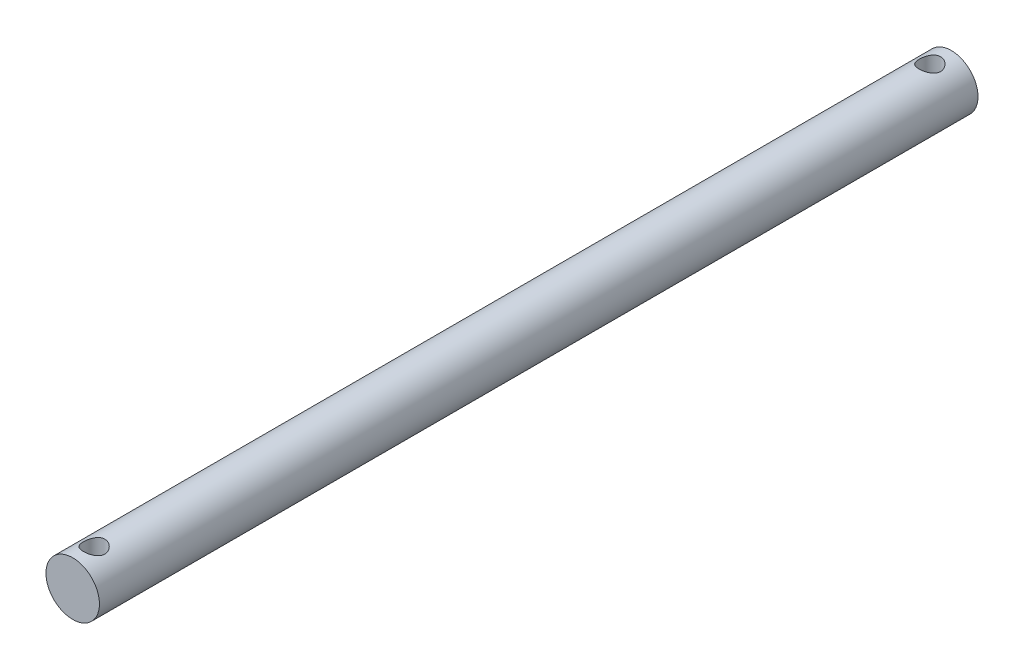
ISO-10303-21;
HEADER;
FILE_DESCRIPTION(('STEP AP214'),'2;1');
FILE_NAME('part.step','',(''),(''),'','','');
FILE_SCHEMA(('AUTOMOTIVE_DESIGN { 1 0 10303 214 1 1 1 1 }'));
ENDSEC;
DATA;
#1=APPLICATION_CONTEXT('core data for automotive mechanical design processes');
#2=APPLICATION_PROTOCOL_DEFINITION('international standard','automotive_design',2000,#1);
#3=PRODUCT_CONTEXT('',#1,'mechanical');
#4=PRODUCT('Part','Part','',(#3));
#5=PRODUCT_RELATED_PRODUCT_CATEGORY('part','',(#4));
#6=PRODUCT_DEFINITION_FORMATION('','',#4);
#7=PRODUCT_DEFINITION_CONTEXT('part definition',#1,'design');
#8=PRODUCT_DEFINITION('design','',#6,#7);
#9=PRODUCT_DEFINITION_SHAPE('','',#8);
#10=(LENGTH_UNIT() NAMED_UNIT(*) SI_UNIT(.MILLI.,.METRE.));
#11=(NAMED_UNIT(*) PLANE_ANGLE_UNIT() SI_UNIT($,.RADIAN.));
#12=(NAMED_UNIT(*) SI_UNIT($,.STERADIAN.) SOLID_ANGLE_UNIT());
#13=UNCERTAINTY_MEASURE_WITH_UNIT(LENGTH_MEASURE(1.E-05),#10,'distance_accuracy_value','');
#14=(GEOMETRIC_REPRESENTATION_CONTEXT(3) GLOBAL_UNCERTAINTY_ASSIGNED_CONTEXT((#13)) GLOBAL_UNIT_ASSIGNED_CONTEXT((#10,
#11,#12)) REPRESENTATION_CONTEXT('',''));
#15=CARTESIAN_POINT('',(0.,0.,0.));
#16=DIRECTION('',(0.,0.,1.));
#17=DIRECTION('',(1.,0.,0.));
#18=AXIS2_PLACEMENT_3D('',#15,#16,#17);
#19=CARTESIAN_POINT('',(0.,0.,130.175));
#20=DIRECTION('',(0.,0.,-1.));
#21=DIRECTION('',(-1.,0.,0.));
#22=AXIS2_PLACEMENT_3D('',#19,#20,#21);
#23=CYLINDRICAL_SURFACE('',#22,3.9624);
#24=CARTESIAN_POINT('',(0.,-3.9624,4.7625));
#25=CARTESIAN_POINT('',(0.0853117270718676,-3.96239416664373,4.76249211930106));
#26=CARTESIAN_POINT('',(0.170771012783033,-3.95961253187258,4.75558204726005));
#27=CARTESIAN_POINT('',(0.339280209794605,-3.94875664272095,4.72818133192485));
#28=CARTESIAN_POINT('',(0.422322940365626,-3.94066802223273,4.70765382430656));
#29=CARTESIAN_POINT('',(0.58328993969218,-3.92006972049317,4.65388529051548));
#30=CARTESIAN_POINT('',(0.661230017057729,-3.90757454272,4.62068594252038));
#31=CARTESIAN_POINT('',(0.810363301587512,-3.87939329710751,4.54268180814705));
#32=CARTESIAN_POINT('',(0.881558827817698,-3.863708331934,4.49788103076507));
#33=CARTESIAN_POINT('',(1.01864732948285,-3.82990464333274,4.39570983361455));
#34=CARTESIAN_POINT('',(1.08418010359647,-3.81171021752442,4.33788133563253));
#35=CARTESIAN_POINT('',(1.20492218930694,-3.7752829774358,4.21226313625752));
#36=CARTESIAN_POINT('',(1.26012643608792,-3.75705014873227,4.14446857673682));
#37=CARTESIAN_POINT('',(1.36107386243811,-3.72170442663272,3.99716443713701));
#38=CARTESIAN_POINT('',(1.40628412127965,-3.70467796939796,3.91726677000261));
#39=CARTESIAN_POINT('',(1.4824632905671,-3.67486086596433,3.75021696793719));
#40=CARTESIAN_POINT('',(1.51343898680089,-3.66206820228051,3.66306831309015));
#41=CARTESIAN_POINT('',(1.55881183659324,-3.64298009307872,3.48812937993786));
#42=CARTESIAN_POINT('',(1.57389868874412,-3.63641570103484,3.40054840510339));
#43=CARTESIAN_POINT('',(1.58921987839996,-3.62974807106187,3.22387087016432));
#44=CARTESIAN_POINT('',(1.58946155192944,-3.62964164180919,3.1347750804086));
#45=CARTESIAN_POINT('',(1.575608087631,-3.6356726055801,2.9642342294068));
#46=CARTESIAN_POINT('',(1.56251330699092,-3.64137433896395,2.88268950204168));
#47=CARTESIAN_POINT('',(1.5240270084585,-3.65764778306397,2.72307002468737));
#48=CARTESIAN_POINT('',(1.49863333724794,-3.66822034656052,2.64499588495105));
#49=CARTESIAN_POINT('',(1.43578621930772,-3.69327658525766,2.49264699728583));
#50=CARTESIAN_POINT('',(1.39809683496274,-3.7078358006729,2.41848255642073));
#51=CARTESIAN_POINT('',(1.31189385068063,-3.73920425029952,2.27725764300055));
#52=CARTESIAN_POINT('',(1.26337617722401,-3.75601433031439,2.21019985795348));
#53=CARTESIAN_POINT('',(1.15247025125588,-3.79157859533404,2.07961772033809));
#54=CARTESIAN_POINT('',(1.08929797701747,-3.81038243478567,2.01677098685352));
#55=CARTESIAN_POINT('',(0.953110948774044,-3.84670714404858,1.902346296881));
#56=CARTESIAN_POINT('',(0.880094226746658,-3.86422775624386,1.85077059902449));
#57=CARTESIAN_POINT('',(0.724363732588358,-3.89645338462923,1.75945886214644));
#58=CARTESIAN_POINT('',(0.641486057700651,-3.91109551133595,1.71997854355175));
#59=CARTESIAN_POINT('',(0.469530085969015,-3.93543864002888,1.65575379210914));
#60=CARTESIAN_POINT('',(0.380454975359993,-3.94514216003095,1.63100184870746));
#61=CARTESIAN_POINT('',(0.204311847288936,-3.95805539170234,1.59830871838179));
#62=CARTESIAN_POINT('',(0.117438504602532,-3.96161635318634,1.5894569422447));
#63=CARTESIAN_POINT('',(-0.0566169135851247,-3.96295024554235,1.58612567238437));
#64=CARTESIAN_POINT('',(-0.143798902846543,-3.96072468264188,1.59164243854207));
#65=CARTESIAN_POINT('',(-0.311864203819767,-3.95096541555836,1.61622278776102));
#66=CARTESIAN_POINT('',(-0.392854247186952,-3.94367566936803,1.63466410153299));
#67=CARTESIAN_POINT('',(-0.550515216479773,-3.92477456539392,1.68372262237051));
#68=CARTESIAN_POINT('',(-0.62718558643701,-3.9131626527772,1.7143413926807));
#69=CARTESIAN_POINT('',(-0.776671825040636,-3.88630174678252,1.7878847754524));
#70=CARTESIAN_POINT('',(-0.849297865243658,-3.87095230097636,1.83115738588586));
#71=CARTESIAN_POINT('',(-0.986513042497235,-3.83827939599824,1.92839413640022));
#72=CARTESIAN_POINT('',(-1.05109893605944,-3.82095514553132,1.98236256868968));
#73=CARTESIAN_POINT('',(-1.17488814946077,-3.78479622435235,2.103650435357));
#74=CARTESIAN_POINT('',(-1.23345169378678,-3.76593750910618,2.17161737310557));
#75=CARTESIAN_POINT('',(-1.3384999511022,-3.72989598565993,2.31674632071108));
#76=CARTESIAN_POINT('',(-1.38498264693781,-3.71271345763364,2.39390986300287));
#77=CARTESIAN_POINT('',(-1.46485133239264,-3.68194013043205,2.5564216147768));
#78=CARTESIAN_POINT('',(-1.4981038159132,-3.66838637510372,2.6418429536227));
#79=CARTESIAN_POINT('',(-1.5494941460913,-3.64698112621987,2.81777977694297));
#80=CARTESIAN_POINT('',(-1.56764319695997,-3.63912540623532,2.90829143194668));
#81=CARTESIAN_POINT('',(-1.58723971665741,-3.63061804319504,3.08480182070462));
#82=CARTESIAN_POINT('',(-1.58979784556331,-3.62948746901891,3.17065492056377));
#83=CARTESIAN_POINT('',(-1.58105828726621,-3.63330307077312,3.34150668272671));
#84=CARTESIAN_POINT('',(-1.56976237222211,-3.63824846948727,3.42650545291117));
#85=CARTESIAN_POINT('',(-1.53454341699213,-3.65323574640425,3.5897688823369));
#86=CARTESIAN_POINT('',(-1.51114082490252,-3.66306695290778,3.66816691775275));
#87=CARTESIAN_POINT('',(-1.45286057138561,-3.6865691443393,3.81995465974231));
#88=CARTESIAN_POINT('',(-1.41797973865852,-3.70024119029212,3.89334297541701));
#89=CARTESIAN_POINT('',(-1.3354212120285,-3.73085856653308,4.03761552660462));
#90=CARTESIAN_POINT('',(-1.28712414414707,-3.74794669035745,4.10811453159655));
#91=CARTESIAN_POINT('',(-1.18000808273821,-3.78303688506396,4.2403557778298));
#92=CARTESIAN_POINT('',(-1.12118589927164,-3.8010392318397,4.30209535407475));
#93=CARTESIAN_POINT('',(-0.990129236409028,-3.83733892894263,4.41919200221078));
#94=CARTESIAN_POINT('',(-0.91727072158657,-3.85557912432534,4.47387145882592));
#95=CARTESIAN_POINT('',(-0.762721357089437,-3.88910173721633,4.57024279467017));
#96=CARTESIAN_POINT('',(-0.681026427799037,-3.90438277937339,4.61192864020734));
#97=CARTESIAN_POINT('',(-0.512612293189794,-3.93000833052496,4.68015468741471));
#98=CARTESIAN_POINT('',(-0.426014442405737,-3.94043917717235,4.70696156880167));
#99=CARTESIAN_POINT('',(-0.249201615949017,-3.95554325966711,4.7454098677266));
#100=CARTESIAN_POINT('',(-0.158999059586053,-3.96023475540089,4.75709938833736));
#101=CARTESIAN_POINT('',(-0.0457330899803865,-3.96220361378713,4.76200812237842));
#102=CARTESIAN_POINT('',(-0.0228718479665289,-3.96240156390736,4.7625021127945));
#103=CARTESIAN_POINT('',(0.,-3.9624,4.7625));
#104=B_SPLINE_CURVE_WITH_KNOTS('',3,(#24,#25,#26,#27,#28,#29,#30,#31,#32,#33,#34,#35,#36,#37,
#38,#39,#40,#41,#42,#43,#44,#45,#46,#47,#48,#49,#50,#51,#52,#53,#54,#55,#56,#57,#58,#59,#60,#61,
#62,#63,#64,#65,#66,#67,#68,#69,#70,#71,#72,#73,#74,#75,#76,#77,#78,#79,#80,#81,#82,#83,#84,#85,
#86,#87,#88,#89,#90,#91,#92,#93,#94,#95,#96,#97,#98,#99,#100,#101,#102,#103),.UNSPECIFIED.,.T.,
.F.,(4,2,2,2,2,2,2,2,2,2,2,2,2,2,2,2,2,2,2,2,2,2,2,2,2,2,2,2,2,2,2,2,2,2,2,2,2,2,2,4),(0.,
0.255873929494163,0.512443388183724,0.768176151866853,1.02382066204938,1.2904702136267,
1.55725018179778,1.8359498024818,2.11451642551445,2.38041834160662,2.646188856203,
2.89339325556369,3.1406409516974,3.39294340285309,3.64534092872686,3.9173176007395,
4.1893487249715,4.46678713369948,4.74408394461069,5.00492203806862,5.26569224238361,
5.51470010088076,5.76373993534178,6.02040300035023,6.27716927297268,6.55094094110412,
6.82475829189516,7.1012726199954,7.37758163757344,7.63395264349523,7.89029085879074,
8.1364269015365,8.38263100588646,8.64296045355352,8.90336893560795,9.18073833868855,
9.45823634935123,9.73058529806197,10.0020654893605,10.0706646118358),.UNSPECIFIED.);
#105=CARTESIAN_POINT('',(0.,-3.9624,4.7625));
#106=VERTEX_POINT('',#105);
#107=EDGE_CURVE('E10',#106,#106,#104,.T.);
#108=ORIENTED_EDGE('',*,*,#107,.T.);
#109=EDGE_LOOP('',(#108));
#110=FACE_BOUND('',#109,.T.);
#111=CARTESIAN_POINT('',(0.,3.9624,4.7625));
#112=CARTESIAN_POINT('',(-0.0853117270718668,3.96239416664373,4.76249211930106));
#113=CARTESIAN_POINT('',(-0.170771012783032,3.95961253187258,4.75558204726005));
#114=CARTESIAN_POINT('',(-0.339280209794604,3.94875664272095,4.72818133192485));
#115=CARTESIAN_POINT('',(-0.422322940365625,3.94066802223273,4.70765382430656));
#116=CARTESIAN_POINT('',(-0.583289939692179,3.92006972049317,4.65388529051548));
#117=CARTESIAN_POINT('',(-0.661230017057728,3.90757454272,4.62068594252038));
#118=CARTESIAN_POINT('',(-0.810363301587511,3.87939329710751,4.54268180814705));
#119=CARTESIAN_POINT('',(-0.881558827817697,3.863708331934,4.49788103076507));
#120=CARTESIAN_POINT('',(-1.01864732948285,3.82990464333274,4.39570983361455));
#121=CARTESIAN_POINT('',(-1.08418010359647,3.81171021752442,4.33788133563253));
#122=CARTESIAN_POINT('',(-1.20492218930694,3.7752829774358,4.21226313625752));
#123=CARTESIAN_POINT('',(-1.26012643608791,3.75705014873227,4.14446857673682));
#124=CARTESIAN_POINT('',(-1.36107386243811,3.72170442663272,3.99716443713701));
#125=CARTESIAN_POINT('',(-1.40628412127964,3.70467796939796,3.91726677000261));
#126=CARTESIAN_POINT('',(-1.4824632905671,3.67486086596433,3.75021696793719));
#127=CARTESIAN_POINT('',(-1.51343898680089,3.66206820228051,3.66306831309015));
#128=CARTESIAN_POINT('',(-1.55881183659324,3.64298009307872,3.48812937993786));
#129=CARTESIAN_POINT('',(-1.57389868874412,3.63641570103485,3.40054840510339));
#130=CARTESIAN_POINT('',(-1.58921987839996,3.62974807106187,3.22387087016431));
#131=CARTESIAN_POINT('',(-1.58946155192944,3.62964164180919,3.1347750804086));
#132=CARTESIAN_POINT('',(-1.575608087631,3.6356726055801,2.9642342294068));
#133=CARTESIAN_POINT('',(-1.56251330699092,3.64137433896395,2.88268950204168));
#134=CARTESIAN_POINT('',(-1.5240270084585,3.65764778306397,2.72307002468737));
#135=CARTESIAN_POINT('',(-1.49863333724794,3.66822034656052,2.64499588495105));
#136=CARTESIAN_POINT('',(-1.43578621930772,3.69327658525766,2.49264699728583));
#137=CARTESIAN_POINT('',(-1.39809683496274,3.7078358006729,2.41848255642073));
#138=CARTESIAN_POINT('',(-1.31189385068063,3.73920425029953,2.27725764300054));
#139=CARTESIAN_POINT('',(-1.26337617722401,3.75601433031439,2.21019985795348));
#140=CARTESIAN_POINT('',(-1.15247025125588,3.79157859533404,2.07961772033809));
#141=CARTESIAN_POINT('',(-1.08929797701747,3.81038243478567,2.01677098685352));
#142=CARTESIAN_POINT('',(-0.953110948774043,3.84670714404858,1.902346296881));
#143=CARTESIAN_POINT('',(-0.880094226746657,3.86422775624386,1.85077059902449));
#144=CARTESIAN_POINT('',(-0.724363732588358,3.89645338462923,1.75945886214644));
#145=CARTESIAN_POINT('',(-0.64148605770065,3.91109551133595,1.71997854355175));
#146=CARTESIAN_POINT('',(-0.469530085969014,3.93543864002888,1.65575379210914));
#147=CARTESIAN_POINT('',(-0.380454975359992,3.94514216003095,1.63100184870746));
#148=CARTESIAN_POINT('',(-0.204311847288935,3.95805539170234,1.59830871838179));
#149=CARTESIAN_POINT('',(-0.117438504602531,3.96161635318634,1.5894569422447));
#150=CARTESIAN_POINT('',(0.0566169135851255,3.96295024554235,1.58612567238437));
#151=CARTESIAN_POINT('',(0.143798902846544,3.96072468264188,1.59164243854207));
#152=CARTESIAN_POINT('',(0.311864203819768,3.95096541555836,1.61622278776102));
#153=CARTESIAN_POINT('',(0.392854247186953,3.94367566936803,1.63466410153299));
#154=CARTESIAN_POINT('',(0.550515216479773,3.92477456539392,1.68372262237051));
#155=CARTESIAN_POINT('',(0.627185586437011,3.9131626527772,1.7143413926807));
#156=CARTESIAN_POINT('',(0.776671825040637,3.88630174678252,1.7878847754524));
#157=CARTESIAN_POINT('',(0.849297865243659,3.87095230097636,1.83115738588586));
#158=CARTESIAN_POINT('',(0.986513042497236,3.83827939599824,1.92839413640022));
#159=CARTESIAN_POINT('',(1.05109893605944,3.82095514553132,1.98236256868968));
#160=CARTESIAN_POINT('',(1.17488814946077,3.78479622435235,2.103650435357));
#161=CARTESIAN_POINT('',(1.23345169378678,3.76593750910618,2.17161737310557));
#162=CARTESIAN_POINT('',(1.3384999511022,3.72989598565993,2.31674632071108));
#163=CARTESIAN_POINT('',(1.38498264693782,3.71271345763364,2.39390986300287));
#164=CARTESIAN_POINT('',(1.46485133239264,3.68194013043205,2.5564216147768));
#165=CARTESIAN_POINT('',(1.4981038159132,3.66838637510372,2.6418429536227));
#166=CARTESIAN_POINT('',(1.5494941460913,3.64698112621987,2.81777977694296));
#167=CARTESIAN_POINT('',(1.56764319695997,3.63912540623532,2.90829143194668));
#168=CARTESIAN_POINT('',(1.58723971665742,3.63061804319504,3.08480182070462));
#169=CARTESIAN_POINT('',(1.58979784556332,3.62948746901891,3.17065492056377));
#170=CARTESIAN_POINT('',(1.58105828726622,3.63330307077312,3.34150668272671));
#171=CARTESIAN_POINT('',(1.56976237222211,3.63824846948727,3.42650545291117));
#172=CARTESIAN_POINT('',(1.53454341699213,3.65323574640425,3.5897688823369));
#173=CARTESIAN_POINT('',(1.51114082490252,3.66306695290778,3.66816691775275));
#174=CARTESIAN_POINT('',(1.45286057138561,3.6865691443393,3.81995465974231));
#175=CARTESIAN_POINT('',(1.41797973865852,3.70024119029212,3.89334297541701));
#176=CARTESIAN_POINT('',(1.3354212120285,3.73085856653308,4.03761552660462));
#177=CARTESIAN_POINT('',(1.28712414414707,3.74794669035745,4.10811453159655));
#178=CARTESIAN_POINT('',(1.18000808273821,3.78303688506396,4.2403557778298));
#179=CARTESIAN_POINT('',(1.12118589927164,3.8010392318397,4.30209535407475));
#180=CARTESIAN_POINT('',(0.990129236409029,3.83733892894263,4.41919200221078));
#181=CARTESIAN_POINT('',(0.917270721586571,3.85557912432534,4.47387145882592));
#182=CARTESIAN_POINT('',(0.762721357089438,3.88910173721633,4.57024279467017));
#183=CARTESIAN_POINT('',(0.681026427799038,3.90438277937339,4.61192864020734));
#184=CARTESIAN_POINT('',(0.512612293189795,3.93000833052496,4.68015468741471));
#185=CARTESIAN_POINT('',(0.426014442405739,3.94043917717235,4.70696156880167));
#186=CARTESIAN_POINT('',(0.249201615949018,3.95554325966711,4.7454098677266));
#187=CARTESIAN_POINT('',(0.158999059586054,3.96023475540089,4.75709938833736));
#188=CARTESIAN_POINT('',(0.0457330899803875,3.96220361378713,4.76200812237842));
#189=CARTESIAN_POINT('',(0.0228718479665298,3.96240156390736,4.7625021127945));
#190=CARTESIAN_POINT('',(0.,3.9624,4.7625));
#191=B_SPLINE_CURVE_WITH_KNOTS('',3,(#111,#112,#113,#114,#115,#116,#117,#118,#119,#120,#121,
#122,#123,#124,#125,#126,#127,#128,#129,#130,#131,#132,#133,#134,#135,#136,#137,#138,#139,#140,
#141,#142,#143,#144,#145,#146,#147,#148,#149,#150,#151,#152,#153,#154,#155,#156,#157,#158,#159,
#160,#161,#162,#163,#164,#165,#166,#167,#168,#169,#170,#171,#172,#173,#174,#175,#176,#177,#178,
#179,#180,#181,#182,#183,#184,#185,#186,#187,#188,#189,#190),.UNSPECIFIED.,.T.,.F.,(4,2,2,2,2,2,
2,2,2,2,2,2,2,2,2,2,2,2,2,2,2,2,2,2,2,2,2,2,2,2,2,2,2,2,2,2,2,2,2,4),(0.,0.255873929494163,
0.512443388183724,0.768176151866853,1.02382066204937,1.2904702136267,1.55725018179778,
1.8359498024818,2.11451642551445,2.38041834160662,2.646188856203,2.89339325556369,
3.1406409516974,3.39294340285309,3.64534092872686,3.9173176007395,4.1893487249715,
4.46678713369948,4.74408394461069,5.00492203806862,5.26569224238361,5.51470010088076,
5.76373993534178,6.02040300035023,6.27716927297268,6.55094094110412,6.82475829189516,
7.10127261999539,7.37758163757344,7.63395264349523,7.89029085879074,8.1364269015365,
8.38263100588645,8.64296045355352,8.90336893560795,9.18073833868855,9.45823634935123,
9.73058529806196,10.0020654893605,10.0706646118358),.UNSPECIFIED.);
#192=CARTESIAN_POINT('',(0.,3.9624,4.7625));
#193=VERTEX_POINT('',#192);
#194=EDGE_CURVE('E41',#193,#193,#191,.T.);
#195=ORIENTED_EDGE('',*,*,#194,.T.);
#196=EDGE_LOOP('',(#195));
#197=FACE_BOUND('',#196,.T.);
#198=CARTESIAN_POINT('',(0.,-3.9624,128.5875));
#199=CARTESIAN_POINT('',(0.0853117270718835,-3.96239416664373,128.587492119301));
#200=CARTESIAN_POINT('',(0.170771012783048,-3.95961253187258,128.58058204726));
#201=CARTESIAN_POINT('',(0.33928020979462,-3.94875664272095,128.553181331925));
#202=CARTESIAN_POINT('',(0.42232294036564,-3.94066802223272,128.532653824307));
#203=CARTESIAN_POINT('',(0.583289939692193,-3.92006972049317,128.478885290515));
#204=CARTESIAN_POINT('',(0.661230017057741,-3.90757454272,128.44568594252));
#205=CARTESIAN_POINT('',(0.810363301587525,-3.87939329710751,128.367681808147));
#206=CARTESIAN_POINT('',(0.881558827817712,-3.86370833193399,128.322881030765));
#207=CARTESIAN_POINT('',(1.01864732948287,-3.82990464333273,128.220709833615));
#208=CARTESIAN_POINT('',(1.08418010359648,-3.81171021752442,128.162881335633));
#209=CARTESIAN_POINT('',(1.20492218930695,-3.7752829774358,128.037263136257));
#210=CARTESIAN_POINT('',(1.26012643608792,-3.75705014873227,127.969468576737));
#211=CARTESIAN_POINT('',(1.36107386243812,-3.72170442663272,127.822164437137));
#212=CARTESIAN_POINT('',(1.40628412127965,-3.70467796939796,127.742266770003));
#213=CARTESIAN_POINT('',(1.48246329056711,-3.67486086596433,127.575216967937));
#214=CARTESIAN_POINT('',(1.5134389868009,-3.6620682022805,127.48806831309));
#215=CARTESIAN_POINT('',(1.55881183659326,-3.64298009307871,127.313129379938));
#216=CARTESIAN_POINT('',(1.57389868874413,-3.63641570103484,127.225548405103));
#217=CARTESIAN_POINT('',(1.58921987839998,-3.62974807106187,127.048870870164));
#218=CARTESIAN_POINT('',(1.58946155192946,-3.62964164180918,126.959775080409));
#219=CARTESIAN_POINT('',(1.57560808763102,-3.63567260558009,126.789234229407));
#220=CARTESIAN_POINT('',(1.56251330699094,-3.64137433896394,126.707689502042));
#221=CARTESIAN_POINT('',(1.52402700845852,-3.65764778306396,126.548070024687));
#222=CARTESIAN_POINT('',(1.49863333724796,-3.66822034656051,126.469995884951));
#223=CARTESIAN_POINT('',(1.43578621930774,-3.69327658525765,126.317646997286));
#224=CARTESIAN_POINT('',(1.39809683496277,-3.70783580067289,126.243482556421));
#225=CARTESIAN_POINT('',(1.31189385068066,-3.73920425029951,126.102257643001));
#226=CARTESIAN_POINT('',(1.26337617722404,-3.75601433031438,126.035199857953));
#227=CARTESIAN_POINT('',(1.15247025125591,-3.79157859533403,125.904617720338));
#228=CARTESIAN_POINT('',(1.0892979770175,-3.81038243478566,125.841770986854));
#229=CARTESIAN_POINT('',(0.95311094877408,-3.84670714404857,125.727346296881));
#230=CARTESIAN_POINT('',(0.880094226746693,-3.86422775624385,125.675770599024));
#231=CARTESIAN_POINT('',(0.724363732588388,-3.89645338462922,125.584458862146));
#232=CARTESIAN_POINT('',(0.641486057700676,-3.91109551133594,125.544978543552));
#233=CARTESIAN_POINT('',(0.469530085969032,-3.93543864002887,125.480753792109));
#234=CARTESIAN_POINT('',(0.380454975360006,-3.94514216003095,125.456001848707));
#235=CARTESIAN_POINT('',(0.204311847288946,-3.95805539170234,125.423308718382));
#236=CARTESIAN_POINT('',(0.117438504602544,-3.96161635318634,125.414456942245));
#237=CARTESIAN_POINT('',(-0.056616913585106,-3.96295024554235,125.411125672384));
#238=CARTESIAN_POINT('',(-0.143798902846521,-3.96072468264188,125.416642438542));
#239=CARTESIAN_POINT('',(-0.311864203819743,-3.95096541555837,125.441222787761));
#240=CARTESIAN_POINT('',(-0.392854247186929,-3.94367566936803,125.459664101533));
#241=CARTESIAN_POINT('',(-0.550515216479753,-3.92477456539392,125.50872262237));
#242=CARTESIAN_POINT('',(-0.627185586436993,-3.9131626527772,125.539341392681));
#243=CARTESIAN_POINT('',(-0.776671825040617,-3.88630174678253,125.612884775452));
#244=CARTESIAN_POINT('',(-0.849297865243634,-3.87095230097636,125.656157385886));
#245=CARTESIAN_POINT('',(-0.986513042497209,-3.83827939599824,125.7533941364));
#246=CARTESIAN_POINT('',(-1.05109893605941,-3.82095514553133,125.80736256869));
#247=CARTESIAN_POINT('',(-1.17488814946075,-3.78479622435236,125.928650435357));
#248=CARTESIAN_POINT('',(-1.23345169378675,-3.76593750910619,125.996617373106));
#249=CARTESIAN_POINT('',(-1.33849995110217,-3.72989598565994,126.141746320711));
#250=CARTESIAN_POINT('',(-1.38498264693779,-3.71271345763365,126.218909863003));
#251=CARTESIAN_POINT('',(-1.46485133239262,-3.68194013043206,126.381421614777));
#252=CARTESIAN_POINT('',(-1.49810381591318,-3.66838637510373,126.466842953623));
#253=CARTESIAN_POINT('',(-1.54949414609128,-3.64698112621988,126.642779776943));
#254=CARTESIAN_POINT('',(-1.56764319695995,-3.63912540623533,126.733291431947));
#255=CARTESIAN_POINT('',(-1.5872397166574,-3.63061804319505,126.909801820705));
#256=CARTESIAN_POINT('',(-1.5897978455633,-3.62948746901891,126.995654920564));
#257=CARTESIAN_POINT('',(-1.5810582872662,-3.63330307077313,127.166506682727));
#258=CARTESIAN_POINT('',(-1.56976237222209,-3.63824846948728,127.251505452911));
#259=CARTESIAN_POINT('',(-1.53454341699211,-3.65323574640426,127.414768882337));
#260=CARTESIAN_POINT('',(-1.51114082490251,-3.66306695290778,127.493166917753));
#261=CARTESIAN_POINT('',(-1.4528605713856,-3.6865691443393,127.644954659742));
#262=CARTESIAN_POINT('',(-1.4179797386585,-3.70024119029212,127.718342975417));
#263=CARTESIAN_POINT('',(-1.33542121202848,-3.73085856653309,127.862615526605));
#264=CARTESIAN_POINT('',(-1.28712414414705,-3.74794669035746,127.933114531597));
#265=CARTESIAN_POINT('',(-1.18000808273818,-3.78303688506397,128.06535577783));
#266=CARTESIAN_POINT('',(-1.12118589927161,-3.80103923183971,128.127095354075));
#267=CARTESIAN_POINT('',(-0.990129236409004,-3.83733892894264,128.244192002211));
#268=CARTESIAN_POINT('',(-0.917270721586547,-3.85557912432534,128.298871458826));
#269=CARTESIAN_POINT('',(-0.762721357089421,-3.88910173721633,128.39524279467));
#270=CARTESIAN_POINT('',(-0.681026427799025,-3.90438277937339,128.436928640207));
#271=CARTESIAN_POINT('',(-0.512612293189783,-3.93000833052496,128.505154687415));
#272=CARTESIAN_POINT('',(-0.426014442405724,-3.94043917717235,128.531961568802));
#273=CARTESIAN_POINT('',(-0.249201615949003,-3.95554325966711,128.570409867727));
#274=CARTESIAN_POINT('',(-0.158999059586041,-3.96023475540089,128.582099388337));
#275=CARTESIAN_POINT('',(-0.0457330899803744,-3.96220361378713,128.587008122378));
#276=CARTESIAN_POINT('',(-0.0228718479665152,-3.96240156390736,128.587502112794));
#277=CARTESIAN_POINT('',(0.,-3.9624,128.5875));
#278=B_SPLINE_CURVE_WITH_KNOTS('',3,(#198,#199,#200,#201,#202,#203,#204,#205,#206,#207,#208,
#209,#210,#211,#212,#213,#214,#215,#216,#217,#218,#219,#220,#221,#222,#223,#224,#225,#226,#227,
#228,#229,#230,#231,#232,#233,#234,#235,#236,#237,#238,#239,#240,#241,#242,#243,#244,#245,#246,
#247,#248,#249,#250,#251,#252,#253,#254,#255,#256,#257,#258,#259,#260,#261,#262,#263,#264,#265,
#266,#267,#268,#269,#270,#271,#272,#273,#274,#275,#276,#277),.UNSPECIFIED.,.T.,.F.,(4,2,2,2,2,2,
2,2,2,2,2,2,2,2,2,2,2,2,2,2,2,2,2,2,2,2,2,2,2,2,2,2,2,2,2,2,2,2,2,4),(0.,0.255873929494164,
0.51244338818372,0.768176151866855,1.02382066204937,1.29047021362669,1.55725018179776,
1.8359498024818,2.11451642551444,2.38041834160659,2.64618885620297,2.89339325556365,
3.14064095169738,3.39294340285306,3.64534092872682,3.91731760073947,4.18934872497148,
4.46678713369947,4.74408394461069,5.00492203806861,5.2656922423836,5.51470010088074,
5.76373993534176,6.02040300035022,6.27716927297266,6.55094094110409,6.82475829189514,
7.10127261999536,7.37758163757342,7.63395264349521,7.89029085879074,8.13642690153646,
8.38263100588645,8.64296045355352,8.90336893560796,9.18073833868853,9.45823634935122,
9.73058529806196,10.0020654893605,10.0706646118358),.UNSPECIFIED.);
#279=CARTESIAN_POINT('',(0.,-3.9624,128.5875));
#280=VERTEX_POINT('',#279);
#281=EDGE_CURVE('E45',#280,#280,#278,.T.);
#282=ORIENTED_EDGE('',*,*,#281,.T.);
#283=EDGE_LOOP('',(#282));
#284=FACE_BOUND('',#283,.T.);
#285=CARTESIAN_POINT('',(0.,3.9624,128.5875));
#286=CARTESIAN_POINT('',(-0.0853117270718523,3.96239416664373,128.587492119301));
#287=CARTESIAN_POINT('',(-0.170771012783017,3.95961253187258,128.58058204726));
#288=CARTESIAN_POINT('',(-0.339280209794588,3.94875664272095,128.553181331925));
#289=CARTESIAN_POINT('',(-0.422322940365609,3.94066802223273,128.532653824307));
#290=CARTESIAN_POINT('',(-0.583289939692162,3.92006972049318,128.478885290515));
#291=CARTESIAN_POINT('',(-0.66123001705771,3.90757454272001,128.44568594252));
#292=CARTESIAN_POINT('',(-0.810363301587493,3.87939329710751,128.367681808147));
#293=CARTESIAN_POINT('',(-0.881558827817681,3.863708331934,128.322881030765));
#294=CARTESIAN_POINT('',(-1.01864732948283,3.82990464333274,128.220709833615));
#295=CARTESIAN_POINT('',(-1.08418010359645,3.81171021752443,128.162881335633));
#296=CARTESIAN_POINT('',(-1.20492218930692,3.77528297743581,128.037263136257));
#297=CARTESIAN_POINT('',(-1.26012643608789,3.75705014873228,127.969468576737));
#298=CARTESIAN_POINT('',(-1.36107386243808,3.72170442663273,127.822164437137));
#299=CARTESIAN_POINT('',(-1.40628412127962,3.70467796939797,127.742266770003));
#300=CARTESIAN_POINT('',(-1.48246329056708,3.67486086596434,127.575216967937));
#301=CARTESIAN_POINT('',(-1.51343898680087,3.66206820228051,127.48806831309));
#302=CARTESIAN_POINT('',(-1.55881183659322,3.64298009307872,127.313129379938));
#303=CARTESIAN_POINT('',(-1.5738986887441,3.63641570103485,127.225548405103));
#304=CARTESIAN_POINT('',(-1.58921987839994,3.62974807106188,127.048870870164));
#305=CARTESIAN_POINT('',(-1.58946155192943,3.62964164180919,126.959775080409));
#306=CARTESIAN_POINT('',(-1.57560808763099,3.6356726055801,126.789234229407));
#307=CARTESIAN_POINT('',(-1.5625133069909,3.64137433896396,126.707689502042));
#308=CARTESIAN_POINT('',(-1.52402700845849,3.65764778306397,126.548070024687));
#309=CARTESIAN_POINT('',(-1.49863333724792,3.66822034656053,126.469995884951));
#310=CARTESIAN_POINT('',(-1.43578621930771,3.69327658525767,126.317646997286));
#311=CARTESIAN_POINT('',(-1.39809683496274,3.7078358006729,126.243482556421));
#312=CARTESIAN_POINT('',(-1.31189385068063,3.73920425029952,126.102257643001));
#313=CARTESIAN_POINT('',(-1.26337617722401,3.75601433031439,126.035199857953));
#314=CARTESIAN_POINT('',(-1.15247025125587,3.79157859533404,125.904617720338));
#315=CARTESIAN_POINT('',(-1.08929797701747,3.81038243478567,125.841770986854));
#316=CARTESIAN_POINT('',(-0.953110948774048,3.84670714404858,125.727346296881));
#317=CARTESIAN_POINT('',(-0.880094226746662,3.86422775624386,125.675770599024));
#318=CARTESIAN_POINT('',(-0.724363732588357,3.89645338462923,125.584458862146));
#319=CARTESIAN_POINT('',(-0.641486057700645,3.91109551133595,125.544978543552));
#320=CARTESIAN_POINT('',(-0.469530085969,3.93543864002888,125.480753792109));
#321=CARTESIAN_POINT('',(-0.380454975359974,3.94514216003095,125.456001848707));
#322=CARTESIAN_POINT('',(-0.204311847288914,3.95805539170234,125.423308718382));
#323=CARTESIAN_POINT('',(-0.117438504602512,3.96161635318634,125.414456942245));
#324=CARTESIAN_POINT('',(0.0566169135851379,3.96295024554235,125.411125672384));
#325=CARTESIAN_POINT('',(0.143798902846553,3.96072468264188,125.416642438542));
#326=CARTESIAN_POINT('',(0.311864203819774,3.95096541555836,125.441222787761));
#327=CARTESIAN_POINT('',(0.39285424718696,3.94367566936803,125.459664101533));
#328=CARTESIAN_POINT('',(0.550515216479784,3.92477456539391,125.50872262237));
#329=CARTESIAN_POINT('',(0.627185586437025,3.9131626527772,125.539341392681));
#330=CARTESIAN_POINT('',(0.776671825040648,3.88630174678252,125.612884775452));
#331=CARTESIAN_POINT('',(0.849297865243665,3.87095230097636,125.656157385886));
#332=CARTESIAN_POINT('',(0.98651304249724,3.83827939599823,125.7533941364));
#333=CARTESIAN_POINT('',(1.05109893605944,3.82095514553132,125.80736256869));
#334=CARTESIAN_POINT('',(1.17488814946078,3.78479622435235,125.928650435357));
#335=CARTESIAN_POINT('',(1.23345169378679,3.76593750910618,125.996617373106));
#336=CARTESIAN_POINT('',(1.3384999511022,3.72989598565993,126.141746320711));
#337=CARTESIAN_POINT('',(1.38498264693782,3.71271345763364,126.218909863003));
#338=CARTESIAN_POINT('',(1.46485133239265,3.68194013043205,126.381421614777));
#339=CARTESIAN_POINT('',(1.49810381591321,3.66838637510372,126.466842953623));
#340=CARTESIAN_POINT('',(1.54949414609132,3.64698112621986,126.642779776943));
#341=CARTESIAN_POINT('',(1.56764319695998,3.63912540623532,126.733291431947));
#342=CARTESIAN_POINT('',(1.58723971665743,3.63061804319504,126.909801820705));
#343=CARTESIAN_POINT('',(1.58979784556333,3.6294874690189,126.995654920564));
#344=CARTESIAN_POINT('',(1.58105828726623,3.63330307077312,127.166506682727));
#345=CARTESIAN_POINT('',(1.56976237222212,3.63824846948726,127.251505452911));
#346=CARTESIAN_POINT('',(1.53454341699214,3.65323574640425,127.414768882337));
#347=CARTESIAN_POINT('',(1.51114082490253,3.66306695290777,127.493166917753));
#348=CARTESIAN_POINT('',(1.45286057138563,3.68656914433929,127.644954659742));
#349=CARTESIAN_POINT('',(1.41797973865853,3.70024119029211,127.718342975417));
#350=CARTESIAN_POINT('',(1.33542121202851,3.73085856653308,127.862615526605));
#351=CARTESIAN_POINT('',(1.28712414414708,3.74794669035745,127.933114531597));
#352=CARTESIAN_POINT('',(1.18000808273821,3.78303688506396,128.06535577783));
#353=CARTESIAN_POINT('',(1.12118589927165,3.8010392318397,128.127095354075));
#354=CARTESIAN_POINT('',(0.990129236409035,3.83733892894263,128.244192002211));
#355=CARTESIAN_POINT('',(0.917270721586579,3.85557912432533,128.298871458826));
#356=CARTESIAN_POINT('',(0.762721357089452,3.88910173721633,128.39524279467));
#357=CARTESIAN_POINT('',(0.681026427799057,3.90438277937339,128.436928640207));
#358=CARTESIAN_POINT('',(0.512612293189815,3.93000833052496,128.505154687415));
#359=CARTESIAN_POINT('',(0.426014442405757,3.94043917717235,128.531961568802));
#360=CARTESIAN_POINT('',(0.249201615949036,3.95554325966711,128.570409867727));
#361=CARTESIAN_POINT('',(0.158999059586074,3.96023475540089,128.582099388337));
#362=CARTESIAN_POINT('',(0.0457330899804063,3.96220361378713,128.587008122378));
#363=CARTESIAN_POINT('',(0.0228718479665467,3.96240156390736,128.587502112794));
#364=CARTESIAN_POINT('',(0.,3.9624,128.5875));
#365=B_SPLINE_CURVE_WITH_KNOTS('',3,(#285,#286,#287,#288,#289,#290,#291,#292,#293,#294,#295,
#296,#297,#298,#299,#300,#301,#302,#303,#304,#305,#306,#307,#308,#309,#310,#311,#312,#313,#314,
#315,#316,#317,#318,#319,#320,#321,#322,#323,#324,#325,#326,#327,#328,#329,#330,#331,#332,#333,
#334,#335,#336,#337,#338,#339,#340,#341,#342,#343,#344,#345,#346,#347,#348,#349,#350,#351,#352,
#353,#354,#355,#356,#357,#358,#359,#360,#361,#362,#363,#364),.UNSPECIFIED.,.T.,.F.,(4,2,2,2,2,2,
2,2,2,2,2,2,2,2,2,2,2,2,2,2,2,2,2,2,2,2,2,2,2,2,2,2,2,2,2,2,2,2,2,4),(0.,0.255873929494164,
0.512443388183719,0.768176151866854,1.02382066204937,1.29047021362669,1.55725018179776,
1.83594980248179,2.11451642551443,2.38041834160658,2.64618885620297,2.89339325556368,
3.14064095169738,3.39294340285306,3.64534092872682,3.91731760073947,4.18934872497147,
4.46678713369946,4.74408394461069,5.00492203806861,5.2656922423836,5.51470010088074,
5.76373993534176,6.02040300035022,6.27716927297266,6.55094094110409,6.82475829189514,
7.10127261999536,7.37758163757342,7.63395264349521,7.89029085879074,8.13642690153649,
8.38263100588645,8.64296045355352,8.90336893560796,9.18073833868853,9.45823634935122,
9.73058529806195,10.0020654893605,10.0706646118358),.UNSPECIFIED.);
#366=CARTESIAN_POINT('',(0.,3.9624,128.5875));
#367=VERTEX_POINT('',#366);
#368=EDGE_CURVE('E49',#367,#367,#365,.T.);
#369=ORIENTED_EDGE('',*,*,#368,.T.);
#370=EDGE_LOOP('',(#369));
#371=FACE_BOUND('',#370,.T.);
#372=CARTESIAN_POINT('',(0.,0.,130.175));
#373=DIRECTION('',(0.,0.,1.));
#374=DIRECTION('',(1.,0.,0.));
#375=AXIS2_PLACEMENT_3D('',#372,#373,#374);
#376=CIRCLE('',#375,3.9624);
#377=CARTESIAN_POINT('',(3.9624,0.,130.175));
#378=VERTEX_POINT('',#377);
#379=EDGE_CURVE('E77',#378,#378,#376,.T.);
#380=ORIENTED_EDGE('',*,*,#379,.F.);
#381=EDGE_LOOP('',(#380));
#382=FACE_BOUND('',#381,.T.);
#383=CARTESIAN_POINT('',(0.,0.,0.));
#384=DIRECTION('',(0.,0.,1.));
#385=DIRECTION('',(1.,0.,0.));
#386=AXIS2_PLACEMENT_3D('',#383,#384,#385);
#387=CIRCLE('',#386,3.9624);
#388=CARTESIAN_POINT('',(3.9624,0.,0.));
#389=VERTEX_POINT('',#388);
#390=EDGE_CURVE('E78',#389,#389,#387,.T.);
#391=ORIENTED_EDGE('',*,*,#390,.T.);
#392=EDGE_LOOP('',(#391));
#393=FACE_BOUND('',#392,.T.);
#394=ADVANCED_FACE('F30',(#110,#197,#284,#371,#382,#393),#23,.T.);
#395=CARTESIAN_POINT('',(0.,0.,130.175));
#396=DIRECTION('',(0.,0.,1.));
#397=DIRECTION('',(1.,0.,0.));
#398=AXIS2_PLACEMENT_3D('',#395,#396,#397);
#399=PLANE('',#398);
#400=ORIENTED_EDGE('',*,*,#379,.T.);
#401=EDGE_LOOP('',(#400));
#402=FACE_BOUND('',#401,.T.);
#403=ADVANCED_FACE('F70',(#402),#399,.T.);
#404=CARTESIAN_POINT('',(0.,0.,0.));
#405=DIRECTION('',(0.,0.,1.));
#406=DIRECTION('',(1.,0.,0.));
#407=AXIS2_PLACEMENT_3D('',#404,#405,#406);
#408=PLANE('',#407);
#409=ORIENTED_EDGE('',*,*,#390,.F.);
#410=EDGE_LOOP('',(#409));
#411=FACE_BOUND('',#410,.T.);
#412=ADVANCED_FACE('F68',(#411),#408,.F.);
#413=CARTESIAN_POINT('',(0.,-3.9624,127.));
#414=DIRECTION('',(0.,1.,0.));
#415=DIRECTION('',(0.,0.,1.));
#416=AXIS2_PLACEMENT_3D('',#413,#414,#415);
#417=CYLINDRICAL_SURFACE('',#416,1.5875);
#418=ORIENTED_EDGE('',*,*,#368,.F.);
#419=EDGE_LOOP('',(#418));
#420=FACE_BOUND('',#419,.T.);
#421=ORIENTED_EDGE('',*,*,#281,.F.);
#422=EDGE_LOOP('',(#421));
#423=FACE_BOUND('',#422,.T.);
#424=ADVANCED_FACE('F62',(#420,#423),#417,.F.);
#425=CARTESIAN_POINT('',(0.,-3.9624,3.175));
#426=DIRECTION('',(0.,1.,0.));
#427=DIRECTION('',(0.,0.,1.));
#428=AXIS2_PLACEMENT_3D('',#425,#426,#427);
#429=CYLINDRICAL_SURFACE('',#428,1.5875);
#430=ORIENTED_EDGE('',*,*,#194,.F.);
#431=EDGE_LOOP('',(#430));
#432=FACE_BOUND('',#431,.T.);
#433=ORIENTED_EDGE('',*,*,#107,.F.);
#434=EDGE_LOOP('',(#433));
#435=FACE_BOUND('',#434,.T.);
#436=ADVANCED_FACE('F59',(#432,#435),#429,.F.);
#437=CLOSED_SHELL('',(#394,#403,#412,#424,#436));
#438=MANIFOLD_SOLID_BREP('B2',#437);
#439=ADVANCED_BREP_SHAPE_REPRESENTATION('',(#18,#438),#14);
#440=SHAPE_DEFINITION_REPRESENTATION(#9,#439);
ENDSEC;
END-ISO-10303-21;
